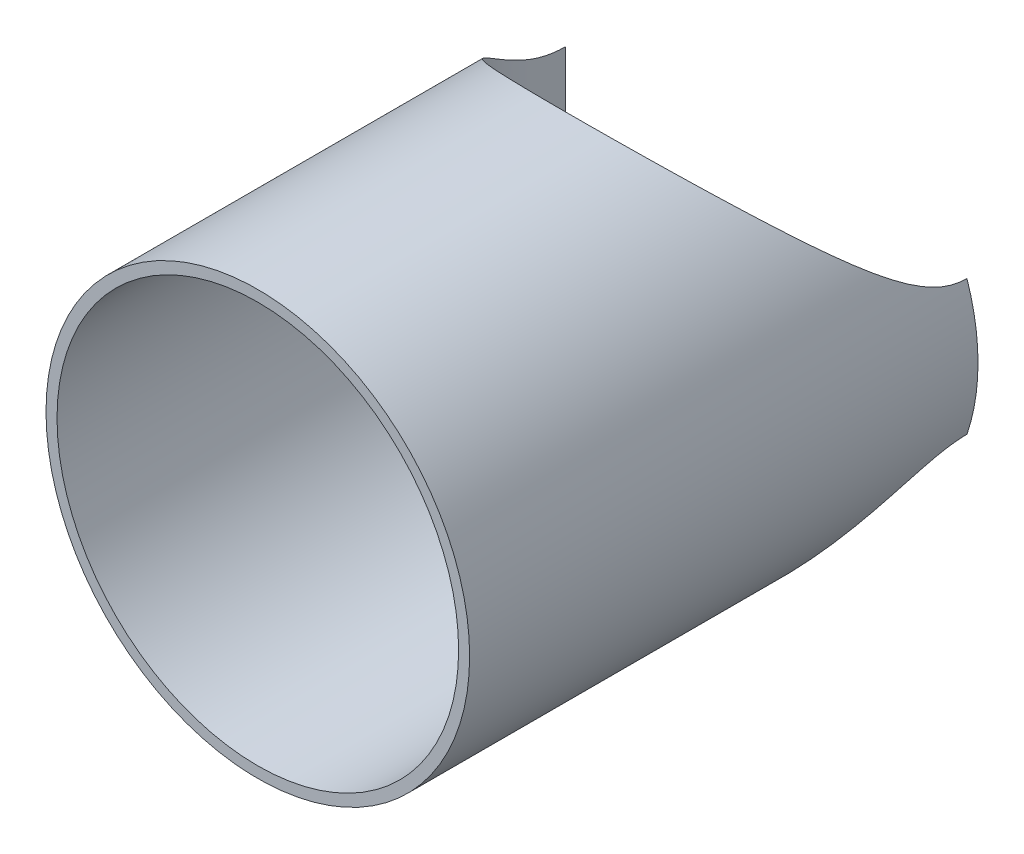
ISO-10303-21;
HEADER;
FILE_DESCRIPTION(('STEP AP214'),'2;1');
FILE_NAME('part.step','',(''),(''),'','','');
FILE_SCHEMA(('AUTOMOTIVE_DESIGN { 1 0 10303 214 1 1 1 1 }'));
ENDSEC;
DATA;
#1=APPLICATION_CONTEXT('core data for automotive mechanical design processes');
#2=APPLICATION_PROTOCOL_DEFINITION('international standard','automotive_design',2000,#1);
#3=PRODUCT_CONTEXT('',#1,'mechanical');
#4=PRODUCT('Part','Part','',(#3));
#5=PRODUCT_RELATED_PRODUCT_CATEGORY('part','',(#4));
#6=PRODUCT_DEFINITION_FORMATION('','',#4);
#7=PRODUCT_DEFINITION_CONTEXT('part definition',#1,'design');
#8=PRODUCT_DEFINITION('design','',#6,#7);
#9=PRODUCT_DEFINITION_SHAPE('','',#8);
#10=(LENGTH_UNIT() NAMED_UNIT(*) SI_UNIT(.MILLI.,.METRE.));
#11=(NAMED_UNIT(*) PLANE_ANGLE_UNIT() SI_UNIT($,.RADIAN.));
#12=(NAMED_UNIT(*) SI_UNIT($,.STERADIAN.) SOLID_ANGLE_UNIT());
#13=UNCERTAINTY_MEASURE_WITH_UNIT(LENGTH_MEASURE(1.E-05),#10,'distance_accuracy_value','');
#14=(GEOMETRIC_REPRESENTATION_CONTEXT(3) GLOBAL_UNCERTAINTY_ASSIGNED_CONTEXT((#13)) GLOBAL_UNIT_ASSIGNED_CONTEXT((#10,
#11,#12)) REPRESENTATION_CONTEXT('',''));
#15=CARTESIAN_POINT('',(0.,0.,0.));
#16=DIRECTION('',(0.,0.,1.));
#17=DIRECTION('',(1.,0.,0.));
#18=AXIS2_PLACEMENT_3D('',#15,#16,#17);
#19=CARTESIAN_POINT('',(0.,0.,0.));
#20=DIRECTION('',(0.,0.,1.));
#21=DIRECTION('',(1.,0.,0.));
#22=AXIS2_PLACEMENT_3D('',#19,#20,#21);
#23=CYLINDRICAL_SURFACE('',#22,30.099);
#24=CARTESIAN_POINT('',(0.,0.,76.2));
#25=DIRECTION('',(0.,0.,1.));
#26=DIRECTION('',(1.,0.,0.));
#27=AXIS2_PLACEMENT_3D('',#24,#25,#26);
#28=CIRCLE('',#27,30.099);
#29=CARTESIAN_POINT('',(30.099,0.,76.2));
#30=VERTEX_POINT('',#29);
#31=EDGE_CURVE('E64',#30,#30,#28,.T.);
#32=ORIENTED_EDGE('',*,*,#31,.T.);
#33=EDGE_LOOP('',(#32));
#34=FACE_BOUND('',#33,.T.);
#35=CARTESIAN_POINT('',(0.,0.,0.));
#36=DIRECTION('',(0.,0.707106781186547,0.707106781186547));
#37=DIRECTION('',(0.,-0.707106781186547,0.707106781186547));
#38=AXIS2_PLACEMENT_3D('',#35,#36,#37);
#39=ELLIPSE('',#38,42.5664140138678,30.099);
#40=CARTESIAN_POINT('',(30.099,0.,0.));
#41=VERTEX_POINT('',#40);
#42=CARTESIAN_POINT('',(-30.099,0.,0.));
#43=VERTEX_POINT('',#42);
#44=EDGE_CURVE('E67',#41,#43,#39,.F.);
#45=ORIENTED_EDGE('',*,*,#44,.T.);
#46=CARTESIAN_POINT('',(-30.099,0.,0.));
#47=CARTESIAN_POINT('',(-30.098985318568,0.475480393485989,0.47521891195386));
#48=CARTESIAN_POINT('',(-30.0877329507728,0.95083389369689,0.950577988778477));
#49=CARTESIAN_POINT('',(-30.0449826319618,1.85238525462279,1.85225892539985));
#50=CARTESIAN_POINT('',(-30.015671431995,2.27864156796261,2.27862707614469));
#51=CARTESIAN_POINT('',(-29.9472197629705,3.03733933537225,3.03735066004044));
#52=CARTESIAN_POINT('',(-29.9116274459269,3.3699245132673,3.36988771675898));
#53=CARTESIAN_POINT('',(-29.8201484161064,4.10802128545047,4.10793830762207));
#54=CARTESIAN_POINT('',(-29.7615121473553,4.51335904867412,4.51329146941154));
#55=CARTESIAN_POINT('',(-29.6636175963412,5.10444029727585,5.10442365435066));
#56=CARTESIAN_POINT('',(-29.6309569725501,5.29074963492187,5.29075319499029));
#57=CARTESIAN_POINT('',(-29.5532767502239,5.71052355913808,5.71051909141452));
#58=CARTESIAN_POINT('',(-29.5072291743275,5.94390015103652,5.94385379089165));
#59=CARTESIAN_POINT('',(-29.3642908880698,6.62557907086577,6.62535563527785));
#60=CARTESIAN_POINT('',(-29.2597519209614,7.0731173374191,7.072708277414));
#61=CARTESIAN_POINT('',(-29.035562303269,7.94207901252028,7.94144560343416));
#62=CARTESIAN_POINT('',(-28.9169865632261,8.36364517273267,8.36296587059356));
#63=CARTESIAN_POINT('',(-28.667722146436,9.18061634040905,9.18003916781785));
#64=CARTESIAN_POINT('',(-28.5380607020909,9.57618309945567,9.5757434054513));
#65=CARTESIAN_POINT('',(-28.2694510213025,10.3413068568017,10.3411438270019));
#66=CARTESIAN_POINT('',(-28.1314839524972,10.7110365247758,10.7110121144949));
#67=CARTESIAN_POINT('',(-27.8122724275982,11.5173451488052,11.5173741870684));
#68=CARTESIAN_POINT('',(-27.6277821645477,11.9533082501665,11.9532047060022));
#69=CARTESIAN_POINT('',(-27.2435599644708,12.8042223241285,12.8039048220308));
#70=CARTESIAN_POINT('',(-27.0446369985875,13.21935682186,13.2189562419321));
#71=CARTESIAN_POINT('',(-26.6335993201723,14.0285139084964,14.0280662091607));
#72=CARTESIAN_POINT('',(-26.4222737655155,14.4227390644655,14.4223229176439));
#73=CARTESIAN_POINT('',(-25.9884023777213,15.1901051652638,15.1898449133207));
#74=CARTESIAN_POINT('',(-25.7666263260341,15.5634649742349,15.5633253609549));
#75=CARTESIAN_POINT('',(-25.4234367522801,16.1134554847771,16.1134267484021));
#76=CARTESIAN_POINT('',(-25.3091964933621,16.2923195115799,16.2923161751523));
#77=CARTESIAN_POINT('',(-25.0625245383121,16.66962148565,16.6696252155313));
#78=CARTESIAN_POINT('',(-24.9295362913955,16.8678803122216,16.8678601978795));
#79=CARTESIAN_POINT('',(-24.5285037583453,17.4505346171212,17.450423591744));
#80=CARTESIAN_POINT('',(-24.2525450380064,17.8322370700131,17.8320394424774));
#81=CARTESIAN_POINT('',(-23.687911608901,18.5753451893683,18.5750391617083));
#82=CARTESIAN_POINT('',(-23.3999176367941,18.9370106520926,18.9366808585484));
#83=CARTESIAN_POINT('',(-22.8127689261721,19.6400166169262,19.6397321892029));
#84=CARTESIAN_POINT('',(-22.5142791803813,19.9816358749001,19.9814175907045));
#85=CARTESIAN_POINT('',(-21.907652135919,20.6446050435793,20.6445257394424));
#86=CARTESIAN_POINT('',(-21.6001630994511,20.9662514353276,20.9662446730009));
#87=CARTESIAN_POINT('',(-20.9534026364498,21.6130108353912,21.6130178718388));
#88=CARTESIAN_POINT('',(-20.6133481317287,21.9377358372432,21.937678689631));
#89=CARTESIAN_POINT('',(-19.9222394838473,22.5669326132764,22.5667657338025));
#90=CARTESIAN_POINT('',(-19.5717537242823,22.8717164509612,22.8715035553092));
#91=CARTESIAN_POINT('',(-18.8610766338937,23.4609602061403,23.4607201384284));
#92=CARTESIAN_POINT('',(-18.5014316340734,23.7457502200068,23.7455272168384));
#93=CARTESIAN_POINT('',(-17.7736765178763,24.295023118125,24.2948830966658));
#94=CARTESIAN_POINT('',(-17.4060892056254,24.5598519025718,24.5597764103869));
#95=CARTESIAN_POINT('',(-16.8453613486564,24.9446093571665,24.9445941841404));
#96=CARTESIAN_POINT('',(-16.6589806106972,25.0694812812232,25.0694801728031));
#97=CARTESIAN_POINT('',(-16.2797689777487,25.3174017975223,25.3174029187787));
#98=CARTESIAN_POINT('',(-16.0868883812194,25.4404125269323,25.4404015114357));
#99=CARTESIAN_POINT('',(-15.5085640734868,25.7999590305462,25.7999006674026));
#100=CARTESIAN_POINT('',(-15.1168775981416,26.0315196551305,26.0314151165279));
#101=CARTESIAN_POINT('',(-14.326168093114,26.4747311609467,26.4745686376895));
#102=CARTESIAN_POINT('',(-13.9275201636607,26.6867171625951,26.6865420652174));
#103=CARTESIAN_POINT('',(-13.1239273551861,27.0907734455747,27.0906218672314));
#104=CARTESIAN_POINT('',(-12.7193247819829,27.2831840018377,27.2830674303672));
#105=CARTESIAN_POINT('',(-11.9048670495782,27.6481228978638,27.6480810031597));
#106=CARTESIAN_POINT('',(-11.4953189160166,27.82099334716,27.8209910039952));
#107=CARTESIAN_POINT('',(-10.6768391221528,28.1450215770673,28.1450238436763));
#108=CARTESIAN_POINT('',(-10.2683244949774,28.2967042211584,28.2966739376233));
#109=CARTESIAN_POINT('',(-9.44661430162609,28.5814149665405,28.5813280076192));
#110=CARTESIAN_POINT('',(-9.03359970845195,28.7147038710893,28.7145926598388));
#111=CARTESIAN_POINT('',(-8.20377452336502,28.962606883001,28.9624809732916));
#112=CARTESIAN_POINT('',(-7.78711276293377,29.077470180184,29.0773533248312));
#113=CARTESIAN_POINT('',(-6.95082399512546,29.2885512753954,29.2884776918698));
#114=CARTESIAN_POINT('',(-6.5313152906884,29.3850023924372,29.3849626808752));
#115=CARTESIAN_POINT('',(-5.89863881522403,29.5161260872024,29.5161183027788));
#116=CARTESIAN_POINT('',(-5.68817796982957,29.5574118562085,29.5574115756736));
#117=CARTESIAN_POINT('',(-5.27617268508135,29.6336544753833,29.6336547419243));
#118=CARTESIAN_POINT('',(-5.0747071579239,29.668824298458,29.6688183108537));
#119=CARTESIAN_POINT('',(-4.47055494354167,29.7679332374165,29.7679025411718));
#120=CARTESIAN_POINT('',(-4.06588222285545,29.8259322799136,29.8258771803079));
#121=CARTESIAN_POINT('',(-3.25501039622014,29.9252496423307,29.9251637564998));
#122=CARTESIAN_POINT('',(-2.84883540568966,29.9666669286378,29.9665745516223));
#123=CARTESIAN_POINT('',(-2.0356232375988,30.0328436633243,30.0327632598885));
#124=CARTESIAN_POINT('',(-1.62859815607806,30.0576772013833,30.0576151505902));
#125=CARTESIAN_POINT('',(-0.814379456959543,30.0907314704971,30.0907097292339));
#126=CARTESIAN_POINT('',(-0.407189725143484,30.0989999999145,30.09900020497));
#127=CARTESIAN_POINT('',(0.40719567468822,30.0990000000855,30.098999795027));
#128=CARTESIAN_POINT('',(0.814391342703672,30.0907312292106,30.0907086670721));
#129=CARTESIAN_POINT('',(1.62861849475221,30.0576761337732,30.0576131959412));
#130=CARTESIAN_POINT('',(2.0356461041677,30.032842147861,30.0327612041389));
#131=CARTESIAN_POINT('',(2.84885990562735,29.9666645879494,29.9665723774635));
#132=CARTESIAN_POINT('',(3.25503402391759,29.9252470609083,29.9251617015146));
#133=CARTESIAN_POINT('',(4.06590072977276,29.8259296987246,29.8258755904031));
#134=CARTESIAN_POINT('',(4.47056923461802,29.7679310324365,29.7679014307025));
#135=CARTESIAN_POINT('',(5.07471384927013,29.6688231306291,29.6688177160125));
#136=CARTESIAN_POINT('',(5.27617601999173,29.6336538582361,29.6336544094408));
#137=CARTESIAN_POINT('',(5.68818151240917,29.5574112006595,29.5574106204963));
#138=CARTESIAN_POINT('',(5.89864587006927,29.5161247035651,29.5161163234578));
#139=CARTESIAN_POINT('',(6.53133018633676,29.3849991468787,29.3849583109834));
#140=CARTESIAN_POINT('',(6.95084323669609,29.2885467744019,29.2884722058895));
#141=CARTESIAN_POINT('',(7.78713705896955,29.0774636871607,29.0773463794967));
#142=CARTESIAN_POINT('',(8.20379959994356,28.9625997939528,28.9624738285326));
#143=CARTESIAN_POINT('',(9.03362285314156,28.7146965483497,28.7145860350778));
#144=CARTESIAN_POINT('',(9.4466348156991,28.5814081437105,28.5813222388906));
#145=CARTESIAN_POINT('',(10.2683363009299,28.296699840878,28.2966705006598));
#146=CARTESIAN_POINT('',(10.6768449389937,28.1450192742031,28.1450220036196));
#147=CARTESIAN_POINT('',(11.4953250433417,27.8209909214456,27.8209880997594));
#148=CARTESIAN_POINT('',(11.9048791096643,27.6481178107907,27.6480749757911));
#149=CARTESIAN_POINT('',(12.7193450799256,27.2831745829744,27.2830569688088));
#150=CARTESIAN_POINT('',(13.1239500791332,27.0907624824144,27.090610239226));
#151=CARTESIAN_POINT('',(13.9275441917372,26.6867046075778,26.6865296134967));
#152=CARTESIAN_POINT('',(14.326191124265,26.4747186828106,26.4745566528152));
#153=CARTESIAN_POINT('',(15.1168953730104,26.0315092503849,26.0314057162566));
#154=CARTESIAN_POINT('',(15.5085777204204,25.7999507433837,25.7998934991677));
#155=CARTESIAN_POINT('',(16.0868946901813,25.4404085042474,25.4403980801925));
#156=CARTESIAN_POINT('',(16.2797720963501,25.3173997586516,25.3174011732362));
#157=CARTESIAN_POINT('',(16.6589838142755,25.069479186787,25.0694777883503));
#158=CARTESIAN_POINT('',(16.8453676836445,24.9446051136968,24.9445893644501));
#159=CARTESIAN_POINT('',(17.4061024070492,24.5598426327232,24.5597660399381));
#160=CARTESIAN_POINT('',(17.7736934673017,24.2950108060206,24.2948698074316));
#161=CARTESIAN_POINT('',(18.5014526849451,23.7457338374215,23.7455103357924));
#162=CARTESIAN_POINT('',(18.8610981922095,23.4609428942948,23.4607026894801));
#163=CARTESIAN_POINT('',(19.5717732636235,22.8716996712724,22.871487325273));
#164=CARTESIAN_POINT('',(19.9222566556677,22.5669173920482,22.5667513857656));
#165=CARTESIAN_POINT('',(20.6133577956094,21.9377266150114,21.9376702736665));
#166=CARTESIAN_POINT('',(20.9534073198009,21.6130061522882,21.613013583751));
#167=CARTESIAN_POINT('',(21.6001678392282,20.9662466953272,20.9662395531657));
#168=CARTESIAN_POINT('',(21.907661337935,20.6445954230369,20.6445153703922));
#169=CARTESIAN_POINT('',(22.5142943181165,19.9816188801134,19.9813997375088));
#170=CARTESIAN_POINT('',(22.8127857033715,19.6399971938374,19.6397121883246));
#171=CARTESIAN_POINT('',(23.3999349778204,18.936989202354,18.9366594003836));
#172=CARTESIAN_POINT('',(23.6879280410751,18.5753242115893,18.5750184634092));
#173=CARTESIAN_POINT('',(24.2525573856803,17.8322201496979,17.8320231867786));
#174=CARTESIAN_POINT('',(24.5285131031769,17.4505213519177,17.4504110813527));
#175=CARTESIAN_POINT('',(24.9295405317879,16.8678739917975,16.8678542808275));
#176=CARTESIAN_POINT('',(25.0625266135645,16.6696183114317,16.6696222410965));
#177=CARTESIAN_POINT('',(25.3091985254514,16.2923164033348,16.292312888081));
#178=CARTESIAN_POINT('',(25.4234407395912,16.113449242814,16.1134201503581));
#179=CARTESIAN_POINT('',(25.7666344927702,15.5634515808611,15.5633112777925));
#180=CARTESIAN_POINT('',(25.9884127062851,15.1900876255962,15.1898267499633));
#181=CARTESIAN_POINT('',(26.4222861956628,14.4227163221053,14.4222998173));
#182=CARTESIAN_POINT('',(26.6336118489688,14.0284901526519,14.0280422994347));
#183=CARTESIAN_POINT('',(27.0446479434258,13.2193343322196,13.2189339867342));
#184=CARTESIAN_POINT('',(27.2435693940279,12.804202158083,12.8038850725984));
#185=CARTESIAN_POINT('',(27.6277872218809,11.9532963056784,11.9531931665137));
#186=CARTESIAN_POINT('',(27.8122748028096,11.5173391495762,11.5173683841315));
#187=CARTESIAN_POINT('',(28.1314862012979,10.7110308441004,10.711006268096));
#188=CARTESIAN_POINT('',(28.2694552803953,10.3412954471842,10.3411320880589));
#189=CARTESIAN_POINT('',(28.538067367731,9.57616334577004,9.57572325262383));
#190=CARTESIAN_POINT('',(28.6677293423142,9.18059398733348,9.18001652575726));
#191=CARTESIAN_POINT('',(28.9169935615487,8.36362093204785,8.36294156082551));
#192=CARTESIAN_POINT('',(29.035568719758,7.94205550733282,7.94142213685156));
#193=CARTESIAN_POINT('',(29.2597563551888,7.07309870987776,7.07268984167915));
#194=CARTESIAN_POINT('',(29.3642940826438,6.62556460912538,6.6253414061036));
#195=CARTESIAN_POINT('',(29.5072305216952,5.94389332353647,5.94384708428601));
#196=CARTESIAN_POINT('',(29.5532773818686,5.71052014581154,5.71051572999235));
#197=CARTESIAN_POINT('',(29.6309580372945,5.29074388118055,5.29074740004956));
#198=CARTESIAN_POINT('',(29.6636196164334,5.10442877532079,5.10441205868301));
#199=CARTESIAN_POINT('',(29.7615150474253,4.51334007282613,4.51327239608454));
#200=CARTESIAN_POINT('',(29.8201512900554,4.108000584749,4.10791760881365));
#201=CARTESIAN_POINT('',(29.9116290472175,3.3699095572835,3.36987280793674));
#202=CARTESIAN_POINT('',(29.9472204381156,3.03733185566418,3.03734319641539));
#203=CARTESIAN_POINT('',(30.0156719418921,2.27863591206989,2.27862139915212));
#204=CARTESIAN_POINT('',(30.04498341109,1.85237392205932,1.85224756823295));
#205=CARTESIAN_POINT('',(30.0877332200918,0.950822541284751,0.950566624865754));
#206=CARTESIAN_POINT('',(30.0989853201022,0.475474711378948,0.475213233924347));
#207=CARTESIAN_POINT('',(30.099,0.,0.));
#208=B_SPLINE_CURVE_WITH_KNOTS('',3,(#46,#47,#48,#49,#50,#51,#52,#53,#54,#55,#56,#57,#58,#59,
#60,#61,#62,#63,#64,#65,#66,#67,#68,#69,#70,#71,#72,#73,#74,#75,#76,#77,#78,#79,#80,#81,#82,#83,
#84,#85,#86,#87,#88,#89,#90,#91,#92,#93,#94,#95,#96,#97,#98,#99,#100,#101,#102,#103,#104,#105,
#106,#107,#108,#109,#110,#111,#112,#113,#114,#115,#116,#117,#118,#119,#120,#121,#122,#123,#124,
#125,#126,#127,#128,#129,#130,#131,#132,#133,#134,#135,#136,#137,#138,#139,#140,#141,#142,#143,
#144,#145,#146,#147,#148,#149,#150,#151,#152,#153,#154,#155,#156,#157,#158,#159,#160,#161,#162,
#163,#164,#165,#166,#167,#168,#169,#170,#171,#172,#173,#174,#175,#176,#177,#178,#179,#180,#181,
#182,#183,#184,#185,#186,#187,#188,#189,#190,#191,#192,#193,#194,#195,#196,#197,#198,#199,#200,
#201,#202,#203,#204,#205,#206,#207),.UNSPECIFIED.,.F.,.F.,(4,2,2,2,2,2,2,2,2,2,2,2,2,2,2,2,2,2,
2,2,2,2,2,2,2,2,2,2,2,2,2,2,2,2,2,2,2,2,2,2,2,2,2,2,2,2,2,2,2,2,2,2,2,2,2,2,2,2,2,2,2,2,2,2,2,2,
2,2,2,2,2,2,2,2,2,2,2,2,2,2,4),(0.,2.01665786325791,3.82720226731269,5.24205682238538,
6.97048514397844,7.7670017875246,8.76659386417404,10.6902897679571,12.5134779422728,
14.2362220279388,15.8585977242008,17.7885621047546,19.6476221411635,21.4359967457142,
23.1539319049189,23.9866020435695,24.917466187213,26.7355448454385,28.4959704531488,
30.199295760195,31.8461310296767,33.559723171191,35.2256897183344,36.8450208931927,
38.4187949544541,39.1890174419286,39.9681597223175,41.4990242855669,42.9947298696016,
44.4568556426071,45.8870920078196,47.2705997747035,48.6318548871402,49.9727785077635,
51.2953804006636,51.9505317645947,52.573002393295,53.8109829594343,55.0414605000536,
56.2664033013795,57.4878064075668,58.7092273599618,59.934177824461,61.1646528099342,
62.4026206169209,63.0250810569787,63.6802435672878,65.0028594172487,66.343785832346,
67.7050325648137,69.0885208133984,70.5187787377715,71.9809137641101,73.4766162628221,
75.0074654111791,75.7865953721527,76.5568313662496,78.1306223242597,79.7499568803429,
81.4159132850655,83.1294817773767,84.7763423315448,86.479678480267,88.2401004736615,
90.0581610638245,90.9890107557145,91.8216957666841,93.539649518477,95.3280278420254,
97.1870767215966,99.1170150728416,100.739416133787,102.462171090709,104.28535564123,
106.209033426495,107.208611007285,108.005152356461,109.733587736255,111.148410528336,
112.958979021647,114.975612796284),.UNSPECIFIED.);
#209=EDGE_CURVE('E56',#43,#41,#208,.T.);
#210=ORIENTED_EDGE('',*,*,#209,.T.);
#211=EDGE_LOOP('',(#45,#210));
#212=FACE_BOUND('',#211,.T.);
#213=ADVANCED_FACE('F17',(#34,#212),#23,.F.);
#214=CARTESIAN_POINT('',(0.,0.,76.2));
#215=DIRECTION('',(0.,0.,-1.));
#216=DIRECTION('',(-1.,0.,0.));
#217=AXIS2_PLACEMENT_3D('',#214,#215,#216);
#218=PLANE('',#217);
#219=ORIENTED_EDGE('',*,*,#31,.F.);
#220=EDGE_LOOP('',(#219));
#221=FACE_BOUND('',#220,.T.);
#222=CARTESIAN_POINT('',(0.,0.,76.2));
#223=DIRECTION('',(0.,0.,1.));
#224=DIRECTION('',(1.,0.,0.));
#225=AXIS2_PLACEMENT_3D('',#222,#223,#224);
#226=CIRCLE('',#225,31.75);
#227=CARTESIAN_POINT('',(31.75,0.,76.2));
#228=VERTEX_POINT('',#227);
#229=EDGE_CURVE('E87',#228,#228,#226,.F.);
#230=ORIENTED_EDGE('',*,*,#229,.F.);
#231=EDGE_LOOP('',(#230));
#232=FACE_BOUND('',#231,.T.);
#233=ADVANCED_FACE('F122',(#221,#232),#218,.F.);
#234=CARTESIAN_POINT('',(0.,0.,0.));
#235=DIRECTION('',(0.,1.,0.));
#236=DIRECTION('',(0.,0.,1.));
#237=AXIS2_PLACEMENT_3D('',#234,#235,#236);
#238=CYLINDRICAL_SURFACE('',#237,30.099);
#239=ORIENTED_EDGE('',*,*,#209,.F.);
#240=DIRECTION('',(0.,1.,0.));
#241=VECTOR('',#240,1.);
#242=CARTESIAN_POINT('',(-30.099,0.,0.));
#243=LINE('',#242,#241);
#244=CARTESIAN_POINT('',(-30.099,10.1050828299426,0.));
#245=VERTEX_POINT('',#244);
#246=EDGE_CURVE('E61',#245,#43,#243,.F.);
#247=ORIENTED_EDGE('',*,*,#246,.F.);
#248=CARTESIAN_POINT('',(30.099,10.1050828299426,0.));
#249=CARTESIAN_POINT('',(30.0990024116088,10.1050678376119,0.160083375384052));
#250=CARTESIAN_POINT('',(30.0977224362759,10.1088889671927,0.32013874924797));
#251=CARTESIAN_POINT('',(30.0926229967587,10.1240622932876,0.639819928260437));
#252=CARTESIAN_POINT('',(30.0888040495812,10.1354129565738,0.799445814222034));
#253=CARTESIAN_POINT('',(30.073603843615,10.1804670383484,1.27633940743843));
#254=CARTESIAN_POINT('',(30.0584789198683,10.2251741248238,1.59250871054929));
#255=CARTESIAN_POINT('',(30.0190959153679,10.340209557956,2.21330729358007));
#256=CARTESIAN_POINT('',(29.9950133847904,10.410044641773,2.51804182527669));
#257=CARTESIAN_POINT('',(29.9383008062463,10.5720393844869,3.12084584460094));
#258=CARTESIAN_POINT('',(29.9056647910498,10.664214625319,3.41891052090279));
#259=CARTESIAN_POINT('',(29.8099256501204,10.9298248391575,4.18904225023459));
#260=CARTESIAN_POINT('',(29.7404428401177,11.1183256862173,4.65511059488198));
#261=CARTESIAN_POINT('',(29.5831125632253,11.5304220569908,5.56814616465372));
#262=CARTESIAN_POINT('',(29.4952520489898,11.7540424857757,6.01509954600728));
#263=CARTESIAN_POINT('',(29.3016635304398,12.2287164856753,6.89698580397051));
#264=CARTESIAN_POINT('',(29.195739233324,12.4800593885275,7.33171789328778));
#265=CARTESIAN_POINT('',(28.9678361313894,13.0002958062159,8.18593994705969));
#266=CARTESIAN_POINT('',(28.8458606747213,13.2691856550114,8.60543306702575));
#267=CARTESIAN_POINT('',(28.5689329951108,13.8563216958151,9.4872201638841));
#268=CARTESIAN_POINT('',(28.4117519076193,14.1763268479811,9.94763600386587));
#269=CARTESIAN_POINT('',(28.0779498124308,14.8264937025551,10.8541140111439));
#270=CARTESIAN_POINT('',(27.9013245451287,15.1566576189679,11.300173005539));
#271=CARTESIAN_POINT('',(27.528692200023,15.82338827848,12.179870600444));
#272=CARTESIAN_POINT('',(27.3326684665382,16.159960319887,12.6134981079514));
#273=CARTESIAN_POINT('',(26.9213938463561,16.8362019198005,13.4689850283727));
#274=CARTESIAN_POINT('',(26.7061444550196,17.1758712355607,13.890845353188));
#275=CARTESIAN_POINT('',(26.2568759822606,17.8550931696716,14.7223975911971));
#276=CARTESIAN_POINT('',(26.0229071625172,18.1946437948231,15.132118293193));
#277=CARTESIAN_POINT('',(25.5355162799946,18.8725785468634,15.9408309734122));
#278=CARTESIAN_POINT('',(25.2820938388755,19.2109626509316,16.339822742772));
#279=CARTESIAN_POINT('',(24.7556823846837,19.8847014403983,17.1268794385429));
#280=CARTESIAN_POINT('',(24.4827038022581,20.2200576348794,17.5149500383725));
#281=CARTESIAN_POINT('',(23.916798396789,20.8863674940964,18.2801249145522));
#282=CARTESIAN_POINT('',(23.6238719301892,21.2173212373723,18.6572293866815));
#283=CARTESIAN_POINT('',(22.812168712446,22.095907469872,19.6520275896672));
#284=CARTESIAN_POINT('',(22.2749341466818,22.6382935995178,20.2594681366722));
#285=CARTESIAN_POINT('',(21.1418905513982,23.6999123779445,21.4391953566853));
#286=CARTESIAN_POINT('',(20.5460758850414,24.2191427915783,22.0114786380793));
#287=CARTESIAN_POINT('',(19.2956321973179,25.2266689463942,23.1154257832987));
#288=CARTESIAN_POINT('',(18.6410902535028,25.7150087155544,23.6471476920722));
#289=CARTESIAN_POINT('',(17.2717637953146,26.6540366645858,24.6650259085515));
#290=CARTESIAN_POINT('',(16.5569737730577,27.1047213945147,25.1511780416655));
#291=CARTESIAN_POINT('',(15.2510184482247,27.8547731019049,25.9575002341831));
#292=CARTESIAN_POINT('',(14.6726154040723,28.1641159903871,26.2891082839833));
#293=CARTESIAN_POINT('',(13.4832509761465,28.7524649740418,26.9184700547639));
#294=CARTESIAN_POINT('',(12.8723085496809,29.0314884512259,27.21624317771));
#295=CARTESIAN_POINT('',(11.6193644474026,29.5552673372444,27.7742756216149));
#296=CARTESIAN_POINT('',(10.9773656938689,29.8000259618607,28.0345384630091));
#297=CARTESIAN_POINT('',(9.66492186972375,30.2511685653116,28.513628334336));
#298=CARTESIAN_POINT('',(8.99447637186461,30.4575519675299,28.7324547416562));
#299=CARTESIAN_POINT('',(7.62263219001037,30.8296550480932,29.1266063307107));
#300=CARTESIAN_POINT('',(6.92100441012783,30.9949805831179,29.301510033773));
#301=CARTESIAN_POINT('',(5.49781812297932,31.278792764029,29.601563323156));
#302=CARTESIAN_POINT('',(4.77625952524888,31.3972791972789,29.7267126836058));
#303=CARTESIAN_POINT('',(3.32012257619083,31.5844530530131,29.9243376109718));
#304=CARTESIAN_POINT('',(2.58555481391062,31.6531792278501,29.9968541674329));
#305=CARTESIAN_POINT('',(1.11011673133872,31.7391863369222,30.0875965323615));
#306=CARTESIAN_POINT('',(0.369247345573362,31.7564747703981,30.1058302548636));
#307=CARTESIAN_POINT('',(-1.00700594467189,31.7404069564623,30.0888804572843));
#308=CARTESIAN_POINT('',(-1.64257786129064,31.7138284624383,30.0608457643673));
#309=CARTESIAN_POINT('',(-2.90792287128993,31.6229139791232,29.9649165973722));
#310=CARTESIAN_POINT('',(-3.5376966129817,31.5585822645136,29.8970266359839));
#311=CARTESIAN_POINT('',(-4.7870003168588,31.3933789530529,29.7225894740121));
#312=CARTESIAN_POINT('',(-5.40652977443566,31.2925055618209,29.6160403750694));
#313=CARTESIAN_POINT('',(-6.63133918752576,31.0560285898291,29.3660663595947));
#314=CARTESIAN_POINT('',(-7.23661850667483,30.9204234612646,29.2226397996336));
#315=CARTESIAN_POINT('',(-8.42532068960616,30.6178059439654,28.9022505872457));
#316=CARTESIAN_POINT('',(-9.00886705694535,30.4510204667191,28.7255301593417));
#317=CARTESIAN_POINT('',(-10.1558593168664,30.0879195885451,28.3403306246236));
#318=CARTESIAN_POINT('',(-10.7193059819705,29.8916053240582,28.1318527400185));
#319=CARTESIAN_POINT('',(-11.8241459706984,29.4720432672326,27.6856353624601));
#320=CARTESIAN_POINT('',(-12.3655373364365,29.2487930906873,27.4478932791763));
#321=CARTESIAN_POINT('',(-13.4249094873963,28.7779494738171,26.9455994993604));
#322=CARTESIAN_POINT('',(-13.9428852892433,28.5303508868578,26.6810421343955));
#323=CARTESIAN_POINT('',(-14.8228274470021,28.0806510312954,26.1995346905483));
#324=CARTESIAN_POINT('',(-15.1903466498289,27.8834540434483,25.9880863853564));
#325=CARTESIAN_POINT('',(-15.9116759320628,27.478213121773,25.552804131944));
#326=CARTESIAN_POINT('',(-16.2654884308109,27.2701711175216,25.3289723865894));
#327=CARTESIAN_POINT('',(-17.306533647503,26.6309891953456,24.6399353779034));
#328=CARTESIAN_POINT('',(-17.9732097812005,26.1848781086722,24.1572789246674));
#329=CARTESIAN_POINT('',(-19.2527510744828,25.2590510229574,23.1505116481389));
#330=CARTESIAN_POINT('',(-19.8654700403295,24.7792496962305,22.6262950979133));
#331=CARTESIAN_POINT('',(-21.0359682593776,23.7936063559221,21.5423764807767));
#332=CARTESIAN_POINT('',(-21.5937507987539,23.2877659027027,20.9826765396991));
#333=CARTESIAN_POINT('',(-22.475956871833,22.4306479762794,20.0262264897003));
#334=CARTESIAN_POINT('',(-22.8155340777452,22.0849153182814,19.6383392441216));
#335=CARTESIAN_POINT('',(-23.4714899080272,21.3864707942597,18.849459011195));
#336=CARTESIAN_POINT('',(-23.787869244402,21.0337591428625,18.4484664266317));
#337=CARTESIAN_POINT('',(-24.3979840173427,20.3229035077333,17.6337002180426));
#338=CARTESIAN_POINT('',(-24.6917050488466,19.9647562386287,17.2199186937459));
#339=CARTESIAN_POINT('',(-25.2566328231042,19.245109150521,16.3801221965729));
#340=CARTESIAN_POINT('',(-25.5278402965305,18.8836094407441,15.9541076213219));
#341=CARTESIAN_POINT('',(-26.0477171411336,18.1597688526922,15.0903939751357));
#342=CARTESIAN_POINT('',(-26.2964155871288,17.7974296979732,14.6527109509601));
#343=CARTESIAN_POINT('',(-26.7719257602107,17.0737782914292,13.7647194509838));
#344=CARTESIAN_POINT('',(-26.9987359241769,16.71246611473,13.3144100764495));
#345=CARTESIAN_POINT('',(-27.4303909438067,15.9941104190274,12.4007479536233));
#346=CARTESIAN_POINT('',(-27.6352539712372,15.6370635895003,11.9374064034041));
#347=CARTESIAN_POINT('',(-28.0231560554501,14.9307527142003,10.9959884038862));
#348=CARTESIAN_POINT('',(-28.2061995318116,14.5814871040244,10.517914963325));
#349=CARTESIAN_POINT('',(-28.510281963054,13.9754487689108,9.65767208193951));
#350=CARTESIAN_POINT('',(-28.6358545061246,13.7160145298532,9.2789810508314));
#351=CARTESIAN_POINT('',(-28.8736647870594,13.2080488851234,8.5101840425653));
#352=CARTESIAN_POINT('',(-28.9859020884304,12.9595178365055,8.12007769227819));
#353=CARTESIAN_POINT('',(-29.1964685858102,12.4778904975201,7.32695913447385));
#354=CARTESIAN_POINT('',(-29.2948034846,12.2447878993759,6.92395230243523));
#355=CARTESIAN_POINT('',(-29.4767637880279,11.8000219435841,6.10302295446276));
#356=CARTESIAN_POINT('',(-29.5603939244937,11.5883516985791,5.68510528893199));
#357=CARTESIAN_POINT('',(-29.689518547215,11.2524362107442,4.95741332038242));
#358=CARTESIAN_POINT('',(-29.739009543055,11.120739278758,4.65180151652102));
#359=CARTESIAN_POINT('',(-29.8293870793607,10.8759905658424,4.03182260219052));
#360=CARTESIAN_POINT('',(-29.8702727115612,10.7629407533212,3.71745457149452));
#361=CARTESIAN_POINT('',(-29.9425351054047,10.5602396123499,3.08160619190684));
#362=CARTESIAN_POINT('',(-29.9739518968529,10.4704900113991,2.76016212896784));
#363=CARTESIAN_POINT('',(-30.026705782012,10.3182347755237,2.11018511916868));
#364=CARTESIAN_POINT('',(-30.0480505451206,10.2557084141382,1.78165776590303));
#365=CARTESIAN_POINT('',(-30.0755841230809,10.1746294064392,1.21102353266173));
#366=CARTESIAN_POINT('',(-30.0843295600675,10.1487043152397,0.970077550074934));
#367=CARTESIAN_POINT('',(-30.0960551613729,10.1138545885409,0.486116442615424));
#368=CARTESIAN_POINT('',(-30.0990183150396,10.1049801147006,0.243097318771254));
#369=CARTESIAN_POINT('',(-30.099,10.1050828299425,0.));
#370=B_SPLINE_CURVE_WITH_KNOTS('',3,(#248,#249,#250,#251,#252,#253,#254,#255,#256,#257,#258,
#259,#260,#261,#262,#263,#264,#265,#266,#267,#268,#269,#270,#271,#272,#273,#274,#275,#276,#277,
#278,#279,#280,#281,#282,#283,#284,#285,#286,#287,#288,#289,#290,#291,#292,#293,#294,#295,#296,
#297,#298,#299,#300,#301,#302,#303,#304,#305,#306,#307,#308,#309,#310,#311,#312,#313,#314,#315,
#316,#317,#318,#319,#320,#321,#322,#323,#324,#325,#326,#327,#328,#329,#330,#331,#332,#333,#334,
#335,#336,#337,#338,#339,#340,#341,#342,#343,#344,#345,#346,#347,#348,#349,#350,#351,#352,#353,
#354,#355,#356,#357,#358,#359,#360,#361,#362,#363,#364,#365,#366,#367,#368,#369),.UNSPECIFIED.,
.F.,.F.,(4,2,2,2,2,2,2,2,2,2,2,2,2,2,2,2,2,2,2,2,2,2,2,2,2,2,2,2,2,2,2,2,2,2,2,2,2,2,2,2,2,2,2,
2,2,2,2,2,2,2,2,2,2,2,2,2,2,2,2,2,4),(0.,0.480146070160669,0.960194398884364,1.91764588206588,
2.85724523849977,3.7975018474362,5.31735406198969,6.83828898828461,8.37694868934135,
9.91528794485953,11.661542722759,13.4081808140169,15.1563318138315,16.904346961658,
18.6478167955946,20.3913205456659,22.1339011900513,23.8764507048643,26.8006019994074,
29.7250349446661,32.6452011853189,35.5656346779419,37.768696576847,39.9704887294073,
42.172074103408,44.3736925552033,46.5956930624034,48.8177036567543,51.037981924299,
53.2579364758864,55.1658199552747,57.0734874525312,58.9812486385913,60.8890948579918,
62.783562324509,64.677956899467,66.5725192781494,68.4674829834274,69.8698490263903,
71.271966402338,74.076816536292,76.8890463398669,79.7011078198141,81.5627245494454,
83.4242841171324,85.2870175849829,87.1496905745787,89.0099221549076,90.870286482878,
92.7290983656486,94.5875331015436,96.0148654028484,97.4422444111666,98.869036197546,
100.295368014707,101.304090497855,102.312919394676,103.317421603704,104.321157690148,
105.047999629696,105.776976629946),.UNSPECIFIED.);
#371=CARTESIAN_POINT('',(30.099,10.1050828299426,0.));
#372=VERTEX_POINT('',#371);
#373=EDGE_CURVE('E50',#372,#245,#370,.T.);
#374=ORIENTED_EDGE('',*,*,#373,.F.);
#375=DIRECTION('',(0.,1.,0.));
#376=VECTOR('',#375,1.);
#377=CARTESIAN_POINT('',(30.099,0.,0.));
#378=LINE('',#377,#376);
#379=EDGE_CURVE('E63',#41,#372,#378,.T.);
#380=ORIENTED_EDGE('',*,*,#379,.F.);
#381=EDGE_LOOP('',(#239,#247,#374,#380));
#382=FACE_BOUND('',#381,.T.);
#383=ADVANCED_FACE('F59',(#382),#238,.F.);
#384=CARTESIAN_POINT('',(0.,0.,0.));
#385=DIRECTION('',(0.,0.,-1.));
#386=DIRECTION('',(-1.,0.,0.));
#387=AXIS2_PLACEMENT_3D('',#384,#385,#386);
#388=PLANE('',#387);
#389=DIRECTION('',(0.,1.,0.));
#390=VECTOR('',#389,1.);
#391=CARTESIAN_POINT('',(-30.099,0.,0.));
#392=LINE('',#391,#390);
#393=CARTESIAN_POINT('',(-30.099,-10.1050828299426,0.));
#394=VERTEX_POINT('',#393);
#395=EDGE_CURVE('E69',#43,#394,#392,.F.);
#396=ORIENTED_EDGE('',*,*,#395,.T.);
#397=CARTESIAN_POINT('',(0.,0.,0.));
#398=DIRECTION('',(0.,0.,1.));
#399=DIRECTION('',(1.,0.,0.));
#400=AXIS2_PLACEMENT_3D('',#397,#398,#399);
#401=CIRCLE('',#400,31.75);
#402=EDGE_CURVE('E73',#245,#394,#401,.T.);
#403=ORIENTED_EDGE('',*,*,#402,.F.);
#404=ORIENTED_EDGE('',*,*,#246,.T.);
#405=EDGE_LOOP('',(#396,#403,#404));
#406=FACE_BOUND('',#405,.T.);
#407=ADVANCED_FACE('F71',(#406),#388,.T.);
#408=CARTESIAN_POINT('',(0.,0.,0.));
#409=DIRECTION('',(0.,1.,0.));
#410=DIRECTION('',(0.,0.,1.));
#411=AXIS2_PLACEMENT_3D('',#408,#409,#410);
#412=CYLINDRICAL_SURFACE('',#411,30.099);
#413=ORIENTED_EDGE('',*,*,#395,.F.);
#414=ORIENTED_EDGE('',*,*,#44,.F.);
#415=DIRECTION('',(0.,1.,0.));
#416=VECTOR('',#415,1.);
#417=CARTESIAN_POINT('',(30.099,0.,0.));
#418=LINE('',#417,#416);
#419=CARTESIAN_POINT('',(30.099,-10.1050828299426,0.));
#420=VERTEX_POINT('',#419);
#421=EDGE_CURVE('E36',#420,#41,#418,.T.);
#422=ORIENTED_EDGE('',*,*,#421,.F.);
#423=CARTESIAN_POINT('',(-30.099,-10.1050828299426,0.));
#424=CARTESIAN_POINT('',(-30.0990024116088,-10.1050678376119,0.16008337538405));
#425=CARTESIAN_POINT('',(-30.0977224362759,-10.1088889671927,0.320138749247968));
#426=CARTESIAN_POINT('',(-30.0926229967587,-10.1240622932876,0.639819928260433));
#427=CARTESIAN_POINT('',(-30.0888040495812,-10.1354129565738,0.799445814222029));
#428=CARTESIAN_POINT('',(-30.073603843615,-10.1804670383485,1.27633940743842));
#429=CARTESIAN_POINT('',(-30.0584789198683,-10.2251741248238,1.59250871054929));
#430=CARTESIAN_POINT('',(-30.0190959153679,-10.340209557956,2.21330729358007));
#431=CARTESIAN_POINT('',(-29.9950133847904,-10.410044641773,2.51804182527668));
#432=CARTESIAN_POINT('',(-29.9383008062463,-10.5720393844869,3.12084584460093));
#433=CARTESIAN_POINT('',(-29.9056647910498,-10.664214625319,3.41891052090279));
#434=CARTESIAN_POINT('',(-29.8099256501204,-10.9298248391575,4.18904225023458));
#435=CARTESIAN_POINT('',(-29.7404428401178,-11.1183256862173,4.65511059488197));
#436=CARTESIAN_POINT('',(-29.5831125632253,-11.5304220569908,5.56814616465372));
#437=CARTESIAN_POINT('',(-29.4952520489898,-11.7540424857757,6.01509954600727));
#438=CARTESIAN_POINT('',(-29.3016635304398,-12.2287164856753,6.89698580397051));
#439=CARTESIAN_POINT('',(-29.195739233324,-12.4800593885275,7.33171789328778));
#440=CARTESIAN_POINT('',(-28.9678361313894,-13.0002958062159,8.18593994705969));
#441=CARTESIAN_POINT('',(-28.8458606747213,-13.2691856550114,8.60543306702574));
#442=CARTESIAN_POINT('',(-28.5689329951108,-13.8563216958151,9.48722016388409));
#443=CARTESIAN_POINT('',(-28.4117519076193,-14.176326847981,9.94763600386587));
#444=CARTESIAN_POINT('',(-28.0779498124308,-14.8264937025551,10.8541140111438));
#445=CARTESIAN_POINT('',(-27.9013245451287,-15.1566576189679,11.300173005539));
#446=CARTESIAN_POINT('',(-27.528692200023,-15.82338827848,12.179870600444));
#447=CARTESIAN_POINT('',(-27.3326684665382,-16.159960319887,12.6134981079514));
#448=CARTESIAN_POINT('',(-26.9213938463561,-16.8362019198005,13.4689850283727));
#449=CARTESIAN_POINT('',(-26.7061444550196,-17.1758712355607,13.890845353188));
#450=CARTESIAN_POINT('',(-26.2568759822606,-17.8550931696716,14.7223975911971));
#451=CARTESIAN_POINT('',(-26.0229071625172,-18.1946437948231,15.132118293193));
#452=CARTESIAN_POINT('',(-25.5355162799946,-18.8725785468634,15.9408309734122));
#453=CARTESIAN_POINT('',(-25.2820938388755,-19.2109626509316,16.339822742772));
#454=CARTESIAN_POINT('',(-24.7556823846837,-19.8847014403983,17.1268794385428));
#455=CARTESIAN_POINT('',(-24.4827038022581,-20.2200576348794,17.5149500383725));
#456=CARTESIAN_POINT('',(-23.916798396789,-20.8863674940964,18.2801249145522));
#457=CARTESIAN_POINT('',(-23.6238719301892,-21.2173212373723,18.6572293866815));
#458=CARTESIAN_POINT('',(-22.812168712446,-22.095907469872,19.6520275896672));
#459=CARTESIAN_POINT('',(-22.2749341466818,-22.6382935995178,20.2594681366722));
#460=CARTESIAN_POINT('',(-21.1418905513982,-23.6999123779445,21.4391953566853));
#461=CARTESIAN_POINT('',(-20.5460758850414,-24.2191427915783,22.0114786380793));
#462=CARTESIAN_POINT('',(-19.2956321973179,-25.2266689463942,23.1154257832987));
#463=CARTESIAN_POINT('',(-18.6410902535028,-25.7150087155544,23.6471476920722));
#464=CARTESIAN_POINT('',(-17.2717637953146,-26.6540366645858,24.6650259085515));
#465=CARTESIAN_POINT('',(-16.5569737730577,-27.1047213945146,25.1511780416655));
#466=CARTESIAN_POINT('',(-15.2510184482247,-27.8547731019049,25.9575002341831));
#467=CARTESIAN_POINT('',(-14.6726154040723,-28.1641159903871,26.2891082839833));
#468=CARTESIAN_POINT('',(-13.4832509761465,-28.7524649740418,26.9184700547639));
#469=CARTESIAN_POINT('',(-12.8723085496809,-29.0314884512259,27.21624317771));
#470=CARTESIAN_POINT('',(-11.6193644474026,-29.5552673372444,27.7742756216149));
#471=CARTESIAN_POINT('',(-10.9773656938689,-29.8000259618607,28.0345384630091));
#472=CARTESIAN_POINT('',(-9.66492186972376,-30.2511685653116,28.513628334336));
#473=CARTESIAN_POINT('',(-8.99447637186463,-30.4575519675299,28.7324547416562));
#474=CARTESIAN_POINT('',(-7.62263219001039,-30.8296550480932,29.1266063307107));
#475=CARTESIAN_POINT('',(-6.92100441012784,-30.9949805831179,29.301510033773));
#476=CARTESIAN_POINT('',(-5.49781812297933,-31.278792764029,29.601563323156));
#477=CARTESIAN_POINT('',(-4.7762595252489,-31.3972791972789,29.7267126836058));
#478=CARTESIAN_POINT('',(-3.32012257619084,-31.5844530530131,29.9243376109718));
#479=CARTESIAN_POINT('',(-2.58555481391063,-31.6531792278501,29.9968541674329));
#480=CARTESIAN_POINT('',(-1.11011673133873,-31.7391863369222,30.0875965323615));
#481=CARTESIAN_POINT('',(-0.369247345573372,-31.7564747703981,30.1058302548636));
#482=CARTESIAN_POINT('',(1.00700594467188,-31.7404069564623,30.0888804572843));
#483=CARTESIAN_POINT('',(1.64257786129063,-31.7138284624383,30.0608457643673));
#484=CARTESIAN_POINT('',(2.90792287128992,-31.6229139791232,29.9649165973722));
#485=CARTESIAN_POINT('',(3.5376966129817,-31.5585822645136,29.8970266359839));
#486=CARTESIAN_POINT('',(4.7870003168588,-31.3933789530529,29.7225894740121));
#487=CARTESIAN_POINT('',(5.40652977443565,-31.2925055618209,29.6160403750694));
#488=CARTESIAN_POINT('',(6.63133918752575,-31.0560285898291,29.3660663595947));
#489=CARTESIAN_POINT('',(7.23661850667482,-30.9204234612646,29.2226397996337));
#490=CARTESIAN_POINT('',(8.42532068960615,-30.6178059439654,28.9022505872457));
#491=CARTESIAN_POINT('',(9.00886705694534,-30.4510204667191,28.7255301593417));
#492=CARTESIAN_POINT('',(10.1558593168664,-30.0879195885451,28.3403306246236));
#493=CARTESIAN_POINT('',(10.7193059819705,-29.8916053240582,28.1318527400185));
#494=CARTESIAN_POINT('',(11.8241459706984,-29.4720432672326,27.6856353624601));
#495=CARTESIAN_POINT('',(12.3655373364365,-29.2487930906873,27.4478932791763));
#496=CARTESIAN_POINT('',(13.4249094873963,-28.7779494738171,26.9455994993604));
#497=CARTESIAN_POINT('',(13.9428852892433,-28.5303508868578,26.6810421343955));
#498=CARTESIAN_POINT('',(14.8228274470021,-28.0806510312954,26.1995346905483));
#499=CARTESIAN_POINT('',(15.1903466498289,-27.8834540434483,25.9880863853564));
#500=CARTESIAN_POINT('',(15.9116759320628,-27.478213121773,25.552804131944));
#501=CARTESIAN_POINT('',(16.2654884308108,-27.2701711175216,25.3289723865894));
#502=CARTESIAN_POINT('',(17.306533647503,-26.6309891953456,24.6399353779034));
#503=CARTESIAN_POINT('',(17.9732097812005,-26.1848781086722,24.1572789246674));
#504=CARTESIAN_POINT('',(19.2527510744828,-25.2590510229574,23.1505116481389));
#505=CARTESIAN_POINT('',(19.8654700403295,-24.7792496962306,22.6262950979134));
#506=CARTESIAN_POINT('',(21.0359682593776,-23.7936063559222,21.5423764807767));
#507=CARTESIAN_POINT('',(21.5937507987539,-23.2877659027028,20.9826765396991));
#508=CARTESIAN_POINT('',(22.475956871833,-22.4306479762794,20.0262264897003));
#509=CARTESIAN_POINT('',(22.8155340777451,-22.0849153182814,19.6383392441216));
#510=CARTESIAN_POINT('',(23.4714899080272,-21.3864707942597,18.8494590111951));
#511=CARTESIAN_POINT('',(23.7878692444019,-21.0337591428625,18.4484664266317));
#512=CARTESIAN_POINT('',(24.3979840173427,-20.3229035077333,17.6337002180426));
#513=CARTESIAN_POINT('',(24.6917050488466,-19.9647562386287,17.219918693746));
#514=CARTESIAN_POINT('',(25.2566328231042,-19.245109150521,16.3801221965729));
#515=CARTESIAN_POINT('',(25.5278402965305,-18.8836094407441,15.9541076213219));
#516=CARTESIAN_POINT('',(26.0477171411336,-18.1597688526923,15.0903939751357));
#517=CARTESIAN_POINT('',(26.2964155871288,-17.7974296979733,14.6527109509601));
#518=CARTESIAN_POINT('',(26.7719257602107,-17.0737782914292,13.7647194509838));
#519=CARTESIAN_POINT('',(26.9987359241768,-16.71246611473,13.3144100764495));
#520=CARTESIAN_POINT('',(27.4303909438067,-15.9941104190274,12.4007479536234));
#521=CARTESIAN_POINT('',(27.6352539712371,-15.6370635895003,11.9374064034041));
#522=CARTESIAN_POINT('',(28.0231560554501,-14.9307527142003,10.9959884038863));
#523=CARTESIAN_POINT('',(28.2061995318116,-14.5814871040245,10.517914963325));
#524=CARTESIAN_POINT('',(28.510281963054,-13.9754487689108,9.65767208193955));
#525=CARTESIAN_POINT('',(28.6358545061245,-13.7160145298532,9.27898105083144));
#526=CARTESIAN_POINT('',(28.8736647870594,-13.2080488851234,8.51018404256534));
#527=CARTESIAN_POINT('',(28.9859020884304,-12.9595178365055,8.12007769227823));
#528=CARTESIAN_POINT('',(29.1964685858102,-12.4778904975201,7.3269591344739));
#529=CARTESIAN_POINT('',(29.2948034846,-12.2447878993759,6.92395230243528));
#530=CARTESIAN_POINT('',(29.4767637880279,-11.8000219435841,6.10302295446279));
#531=CARTESIAN_POINT('',(29.5603939244937,-11.5883516985791,5.68510528893202));
#532=CARTESIAN_POINT('',(29.6895185472149,-11.2524362107442,4.95741332038245));
#533=CARTESIAN_POINT('',(29.739009543055,-11.120739278758,4.65180151652105));
#534=CARTESIAN_POINT('',(29.8293870793607,-10.8759905658424,4.03182260219055));
#535=CARTESIAN_POINT('',(29.8702727115612,-10.7629407533212,3.71745457149455));
#536=CARTESIAN_POINT('',(29.9425351054047,-10.5602396123499,3.08160619190687));
#537=CARTESIAN_POINT('',(29.9739518968529,-10.4704900113991,2.76016212896787));
#538=CARTESIAN_POINT('',(30.026705782012,-10.3182347755237,2.11018511916871));
#539=CARTESIAN_POINT('',(30.0480505451206,-10.2557084141382,1.78165776590306));
#540=CARTESIAN_POINT('',(30.0755841230809,-10.1746294064392,1.21102353266175));
#541=CARTESIAN_POINT('',(30.0843295600675,-10.1487043152397,0.970077550074955));
#542=CARTESIAN_POINT('',(30.0960551613729,-10.1138545885409,0.486116442615433));
#543=CARTESIAN_POINT('',(30.0990183150396,-10.1049801147006,0.243097318771258));
#544=CARTESIAN_POINT('',(30.099,-10.1050828299426,0.));
#545=B_SPLINE_CURVE_WITH_KNOTS('',3,(#423,#424,#425,#426,#427,#428,#429,#430,#431,#432,#433,
#434,#435,#436,#437,#438,#439,#440,#441,#442,#443,#444,#445,#446,#447,#448,#449,#450,#451,#452,
#453,#454,#455,#456,#457,#458,#459,#460,#461,#462,#463,#464,#465,#466,#467,#468,#469,#470,#471,
#472,#473,#474,#475,#476,#477,#478,#479,#480,#481,#482,#483,#484,#485,#486,#487,#488,#489,#490,
#491,#492,#493,#494,#495,#496,#497,#498,#499,#500,#501,#502,#503,#504,#505,#506,#507,#508,#509,
#510,#511,#512,#513,#514,#515,#516,#517,#518,#519,#520,#521,#522,#523,#524,#525,#526,#527,#528,
#529,#530,#531,#532,#533,#534,#535,#536,#537,#538,#539,#540,#541,#542,#543,#544),.UNSPECIFIED.,
.F.,.F.,(4,2,2,2,2,2,2,2,2,2,2,2,2,2,2,2,2,2,2,2,2,2,2,2,2,2,2,2,2,2,2,2,2,2,2,2,2,2,2,2,2,2,2,
2,2,2,2,2,2,2,2,2,2,2,2,2,2,2,2,2,4),(0.,0.480146070160668,0.960194398884364,1.91764588206588,
2.85724523849977,3.7975018474362,5.31735406198968,6.8382889882846,8.37694868934135,
9.91528794485952,11.661542722759,13.4081808140169,15.1563318138315,16.904346961658,
18.6478167955946,20.3913205456658,22.1339011900513,23.8764507048643,26.8006019994074,
29.7250349446661,32.6452011853189,35.5656346779419,37.768696576847,39.9704887294073,
42.172074103408,44.3736925552033,46.5956930624034,48.8177036567543,51.037981924299,
53.2579364758864,55.1658199552747,57.0734874525312,58.9812486385913,60.8890948579918,
62.783562324509,64.677956899467,66.5725192781494,68.4674829834274,69.8698490263903,
71.271966402338,74.076816536292,76.8890463398668,79.7011078198141,81.5627245494453,
83.4242841171323,85.2870175849829,87.1496905745786,89.0099221549075,90.870286482878,
92.7290983656485,94.5875331015435,96.0148654028483,97.4422444111665,98.8690361975459,
100.295368014707,101.304090497854,102.312919394676,103.317421603704,104.321157690147,
105.047999629696,105.776976629946),.UNSPECIFIED.);
#546=EDGE_CURVE('E27',#394,#420,#545,.T.);
#547=ORIENTED_EDGE('',*,*,#546,.F.);
#548=EDGE_LOOP('',(#413,#414,#422,#547));
#549=FACE_BOUND('',#548,.T.);
#550=ADVANCED_FACE('F75',(#549),#412,.F.);
#551=CARTESIAN_POINT('',(0.,0.,0.));
#552=DIRECTION('',(0.,0.,-1.));
#553=DIRECTION('',(-1.,0.,0.));
#554=AXIS2_PLACEMENT_3D('',#551,#552,#553);
#555=PLANE('',#554);
#556=CARTESIAN_POINT('',(0.,0.,0.));
#557=DIRECTION('',(0.,0.,1.));
#558=DIRECTION('',(1.,0.,0.));
#559=AXIS2_PLACEMENT_3D('',#556,#557,#558);
#560=CIRCLE('',#559,31.75);
#561=EDGE_CURVE('E11',#420,#372,#560,.T.);
#562=ORIENTED_EDGE('',*,*,#561,.F.);
#563=ORIENTED_EDGE('',*,*,#421,.T.);
#564=ORIENTED_EDGE('',*,*,#379,.T.);
#565=EDGE_LOOP('',(#562,#563,#564));
#566=FACE_BOUND('',#565,.T.);
#567=ADVANCED_FACE('F107',(#566),#555,.T.);
#568=CARTESIAN_POINT('',(0.,0.,0.));
#569=DIRECTION('',(0.,0.,1.));
#570=DIRECTION('',(1.,0.,0.));
#571=AXIS2_PLACEMENT_3D('',#568,#569,#570);
#572=CYLINDRICAL_SURFACE('',#571,31.75);
#573=ORIENTED_EDGE('',*,*,#546,.T.);
#574=ORIENTED_EDGE('',*,*,#561,.T.);
#575=ORIENTED_EDGE('',*,*,#373,.T.);
#576=ORIENTED_EDGE('',*,*,#402,.T.);
#577=EDGE_LOOP('',(#573,#574,#575,#576));
#578=FACE_BOUND('',#577,.T.);
#579=ORIENTED_EDGE('',*,*,#229,.T.);
#580=EDGE_LOOP('',(#579));
#581=FACE_BOUND('',#580,.T.);
#582=ADVANCED_FACE('F103',(#578,#581),#572,.T.);
#583=CLOSED_SHELL('',(#213,#233,#383,#407,#550,#567,#582));
#584=MANIFOLD_SOLID_BREP('B1',#583);
#585=ADVANCED_BREP_SHAPE_REPRESENTATION('',(#18,#584),#14);
#586=SHAPE_DEFINITION_REPRESENTATION(#9,#585);
ENDSEC;
END-ISO-10303-21;
